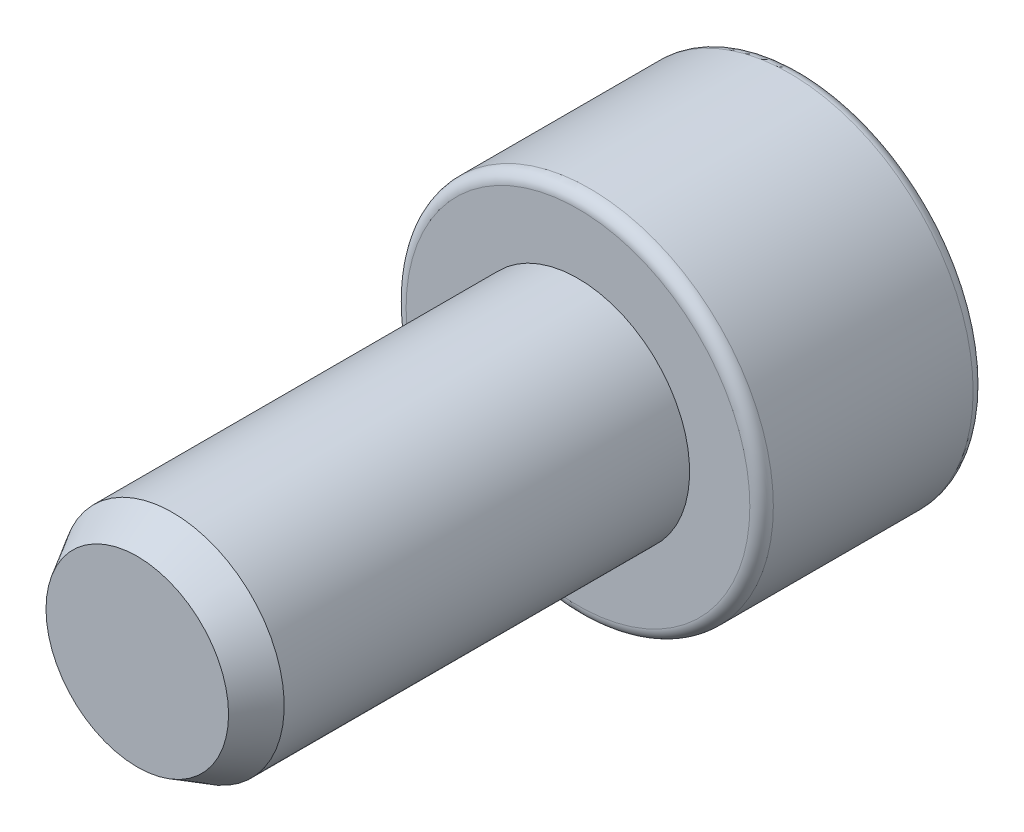
ISO-10303-21;
HEADER;
FILE_DESCRIPTION(('STEP AP214'),'2;1');
FILE_NAME('part.step','',(''),(''),'','','');
FILE_SCHEMA(('AUTOMOTIVE_DESIGN { 1 0 10303 214 1 1 1 1 }'));
ENDSEC;
DATA;
#1=APPLICATION_CONTEXT('core data for automotive mechanical design processes');
#2=APPLICATION_PROTOCOL_DEFINITION('international standard','automotive_design',2000,#1);
#3=PRODUCT_CONTEXT('',#1,'mechanical');
#4=PRODUCT('Part','Part','',(#3));
#5=PRODUCT_RELATED_PRODUCT_CATEGORY('part','',(#4));
#6=PRODUCT_DEFINITION_FORMATION('','',#4);
#7=PRODUCT_DEFINITION_CONTEXT('part definition',#1,'design');
#8=PRODUCT_DEFINITION('design','',#6,#7);
#9=PRODUCT_DEFINITION_SHAPE('','',#8);
#10=(LENGTH_UNIT() NAMED_UNIT(*) SI_UNIT(.MILLI.,.METRE.));
#11=(NAMED_UNIT(*) PLANE_ANGLE_UNIT() SI_UNIT($,.RADIAN.));
#12=(NAMED_UNIT(*) SI_UNIT($,.STERADIAN.) SOLID_ANGLE_UNIT());
#13=UNCERTAINTY_MEASURE_WITH_UNIT(LENGTH_MEASURE(1.E-05),#10,'distance_accuracy_value','');
#14=(GEOMETRIC_REPRESENTATION_CONTEXT(3) GLOBAL_UNCERTAINTY_ASSIGNED_CONTEXT((#13)) GLOBAL_UNIT_ASSIGNED_CONTEXT((#10,
#11,#12)) REPRESENTATION_CONTEXT('',''));
#15=CARTESIAN_POINT('',(0.,0.,0.));
#16=DIRECTION('',(0.,0.,1.));
#17=DIRECTION('',(1.,0.,0.));
#18=AXIS2_PLACEMENT_3D('',#15,#16,#17);
#19=CARTESIAN_POINT('',(3.71474999999991,0.,4.826));
#20=DIRECTION('',(0.,0.,1.));
#21=DIRECTION('',(1.,0.,0.));
#22=AXIS2_PLACEMENT_3D('',#19,#20,#21);
#23=PLANE('',#22);
#24=CARTESIAN_POINT('',(0.,0.,4.826));
#25=DIRECTION('',(0.,0.,1.));
#26=DIRECTION('',(1.,0.,0.));
#27=AXIS2_PLACEMENT_3D('',#24,#25,#26);
#28=CIRCLE('',#27,3.7147499999999);
#29=CARTESIAN_POINT('',(3.71474999999991,0.,4.826));
#30=VERTEX_POINT('',#29);
#31=EDGE_CURVE('E133',#30,#30,#28,.T.);
#32=ORIENTED_EDGE('',*,*,#31,.T.);
#33=EDGE_LOOP('',(#32));
#34=FACE_BOUND('',#33,.T.);
#35=CARTESIAN_POINT('',(0.,0.,4.826));
#36=DIRECTION('',(0.,0.,1.));
#37=DIRECTION('',(1.,0.,0.));
#38=AXIS2_PLACEMENT_3D('',#35,#36,#37);
#39=CIRCLE('',#38,2.413);
#40=CARTESIAN_POINT('',(-2.413,0.,4.826));
#41=VERTEX_POINT('',#40);
#42=EDGE_CURVE('E120',#41,#41,#39,.T.);
#43=ORIENTED_EDGE('',*,*,#42,.F.);
#44=EDGE_LOOP('',(#43));
#45=FACE_BOUND('',#44,.T.);
#46=ADVANCED_FACE('F30',(#34,#45),#23,.T.);
#47=CARTESIAN_POINT('',(0.,0.,0.));
#48=DIRECTION('',(0.,0.,-1.));
#49=DIRECTION('',(-1.,0.,0.));
#50=AXIS2_PLACEMENT_3D('',#47,#48,#49);
#51=PLANE('',#50);
#52=DIRECTION('',(0.866025403784439,0.5,0.));
#53=VECTOR('',#52,1.);
#54=CARTESIAN_POINT('',(-1.984375,1.14567944042317,0.));
#55=LINE('',#54,#53);
#56=CARTESIAN_POINT('',(-1.984375,1.14567944042317,0.));
#57=VERTEX_POINT('',#56);
#58=CARTESIAN_POINT('',(0.,2.29135888084633,0.));
#59=VERTEX_POINT('',#58);
#60=EDGE_CURVE('E45',#57,#59,#55,.T.);
#61=ORIENTED_EDGE('',*,*,#60,.F.);
#62=DIRECTION('',(0.,1.,0.));
#63=VECTOR('',#62,1.);
#64=CARTESIAN_POINT('',(-1.984375,-1.14567944042316,0.));
#65=LINE('',#64,#63);
#66=CARTESIAN_POINT('',(-1.984375,-1.14567944042316,0.));
#67=VERTEX_POINT('',#66);
#68=EDGE_CURVE('E129',#67,#57,#65,.T.);
#69=ORIENTED_EDGE('',*,*,#68,.F.);
#70=DIRECTION('',(-0.866025403784438,0.5,0.));
#71=VECTOR('',#70,1.);
#72=CARTESIAN_POINT('',(0.,-2.29135888084633,0.));
#73=LINE('',#72,#71);
#74=CARTESIAN_POINT('',(0.,-2.29135888084633,0.));
#75=VERTEX_POINT('',#74);
#76=EDGE_CURVE('E127',#75,#67,#73,.T.);
#77=ORIENTED_EDGE('',*,*,#76,.F.);
#78=DIRECTION('',(-0.866025403784438,-0.5,0.));
#79=VECTOR('',#78,1.);
#80=CARTESIAN_POINT('',(1.984375,-1.14567944042316,0.));
#81=LINE('',#80,#79);
#82=CARTESIAN_POINT('',(1.984375,-1.14567944042316,0.));
#83=VERTEX_POINT('',#82);
#84=EDGE_CURVE('E93',#83,#75,#81,.T.);
#85=ORIENTED_EDGE('',*,*,#84,.F.);
#86=DIRECTION('',(0.,-1.,0.));
#87=VECTOR('',#86,1.);
#88=CARTESIAN_POINT('',(1.984375,1.14567944042316,0.));
#89=LINE('',#88,#87);
#90=CARTESIAN_POINT('',(1.984375,1.14567944042316,0.));
#91=VERTEX_POINT('',#90);
#92=EDGE_CURVE('E123',#91,#83,#89,.T.);
#93=ORIENTED_EDGE('',*,*,#92,.F.);
#94=DIRECTION('',(0.866025403784439,-0.5,0.));
#95=VECTOR('',#94,1.);
#96=CARTESIAN_POINT('',(0.,2.29135888084633,0.));
#97=LINE('',#96,#95);
#98=EDGE_CURVE('E119',#59,#91,#97,.T.);
#99=ORIENTED_EDGE('',*,*,#98,.F.);
#100=EDGE_LOOP('',(#61,#69,#77,#85,#93,#99));
#101=FACE_BOUND('',#100,.T.);
#102=CARTESIAN_POINT('',(0.,0.,0.));
#103=DIRECTION('',(0.,0.,1.));
#104=DIRECTION('',(1.,0.,0.));
#105=AXIS2_PLACEMENT_3D('',#102,#103,#104);
#106=CIRCLE('',#105,3.7147499999999);
#107=CARTESIAN_POINT('',(3.71474999999991,0.,0.));
#108=VERTEX_POINT('',#107);
#109=EDGE_CURVE('E147',#108,#108,#106,.T.);
#110=ORIENTED_EDGE('',*,*,#109,.F.);
#111=EDGE_LOOP('',(#110));
#112=FACE_BOUND('',#111,.T.);
#113=ADVANCED_FACE('F163',(#101,#112),#51,.T.);
#114=CARTESIAN_POINT('',(0.,0.,0.254000000000035));
#115=DIRECTION('',(0.,0.,1.));
#116=DIRECTION('',(1.,0.,0.));
#117=AXIS2_PLACEMENT_3D('',#114,#115,#116);
#118=TOROIDAL_SURFACE('',#117,3.7147499999999,0.254000000000001);
#119=ORIENTED_EDGE('',*,*,#109,.T.);
#120=EDGE_LOOP('',(#119));
#121=FACE_BOUND('',#120,.T.);
#122=CARTESIAN_POINT('',(0.,0.,0.254000000000035));
#123=DIRECTION('',(0.,0.,1.));
#124=DIRECTION('',(1.,0.,0.));
#125=AXIS2_PLACEMENT_3D('',#122,#123,#124);
#126=CIRCLE('',#125,3.9687499999999);
#127=CARTESIAN_POINT('',(3.96874999999991,0.,0.254000000000035));
#128=VERTEX_POINT('',#127);
#129=EDGE_CURVE('E144',#128,#128,#126,.T.);
#130=ORIENTED_EDGE('',*,*,#129,.F.);
#131=EDGE_LOOP('',(#130));
#132=FACE_BOUND('',#131,.T.);
#133=ADVANCED_FACE('F169',(#121,#132),#118,.T.);
#134=CARTESIAN_POINT('',(0.,0.,0.));
#135=DIRECTION('',(0.,0.,1.));
#136=DIRECTION('',(1.,0.,0.));
#137=AXIS2_PLACEMENT_3D('',#134,#135,#136);
#138=CYLINDRICAL_SURFACE('',#137,3.9687499999999);
#139=ORIENTED_EDGE('',*,*,#129,.T.);
#140=EDGE_LOOP('',(#139));
#141=FACE_BOUND('',#140,.T.);
#142=CARTESIAN_POINT('',(0.,0.,4.572));
#143=DIRECTION('',(0.,0.,1.));
#144=DIRECTION('',(1.,0.,0.));
#145=AXIS2_PLACEMENT_3D('',#142,#143,#144);
#146=CIRCLE('',#145,3.9687499999999);
#147=CARTESIAN_POINT('',(3.96874999999991,0.,4.572));
#148=VERTEX_POINT('',#147);
#149=EDGE_CURVE('E141',#148,#148,#146,.T.);
#150=ORIENTED_EDGE('',*,*,#149,.F.);
#151=EDGE_LOOP('',(#150));
#152=FACE_BOUND('',#151,.T.);
#153=ADVANCED_FACE('F179',(#141,#152),#138,.T.);
#154=CARTESIAN_POINT('',(0.,0.,4.572));
#155=DIRECTION('',(0.,0.,1.));
#156=DIRECTION('',(1.,0.,0.));
#157=AXIS2_PLACEMENT_3D('',#154,#155,#156);
#158=TOROIDAL_SURFACE('',#157,3.7147499999999,0.254);
#159=ORIENTED_EDGE('',*,*,#149,.T.);
#160=EDGE_LOOP('',(#159));
#161=FACE_BOUND('',#160,.T.);
#162=ORIENTED_EDGE('',*,*,#31,.F.);
#163=EDGE_LOOP('',(#162));
#164=FACE_BOUND('',#163,.T.);
#165=ADVANCED_FACE('F176',(#161,#164),#158,.T.);
#166=CARTESIAN_POINT('',(-1.98437499999998,1.14567944042317,2.54000000000001));
#167=DIRECTION('',(-0.5,0.866025403784439,0.));
#168=DIRECTION('',(-0.866025403784439,-0.5,0.));
#169=AXIS2_PLACEMENT_3D('',#166,#167,#168);
#170=PLANE('',#169);
#171=ORIENTED_EDGE('',*,*,#60,.T.);
#172=DIRECTION('',(0.,0.,-1.));
#173=VECTOR('',#172,1.);
#174=CARTESIAN_POINT('',(0.,2.29135888084633,2.54));
#175=LINE('',#174,#173);
#176=CARTESIAN_POINT('',(0.,2.29135888084633,2.54));
#177=VERTEX_POINT('',#176);
#178=EDGE_CURVE('E75',#177,#59,#175,.T.);
#179=ORIENTED_EDGE('',*,*,#178,.F.);
#180=DIRECTION('',(0.866025403784439,0.5,0.));
#181=VECTOR('',#180,1.);
#182=CARTESIAN_POINT('',(-1.98437499999998,1.14567944042317,2.54000000000001));
#183=LINE('',#182,#181);
#184=CARTESIAN_POINT('',(-1.98437499999998,1.14567944042317,2.54000000000001));
#185=VERTEX_POINT('',#184);
#186=EDGE_CURVE('E131',#185,#177,#183,.T.);
#187=ORIENTED_EDGE('',*,*,#186,.F.);
#188=DIRECTION('',(0.,0.,-1.));
#189=VECTOR('',#188,1.);
#190=CARTESIAN_POINT('',(-1.98437499999998,1.14567944042317,2.54000000000001));
#191=LINE('',#190,#189);
#192=EDGE_CURVE('E53',#185,#57,#191,.T.);
#193=ORIENTED_EDGE('',*,*,#192,.T.);
#194=EDGE_LOOP('',(#171,#179,#187,#193));
#195=FACE_BOUND('',#194,.T.);
#196=ADVANCED_FACE('F174',(#195),#170,.F.);
#197=CARTESIAN_POINT('',(-1.98437499999998,-1.14567944042316,2.54000000000001));
#198=DIRECTION('',(-1.,0.,0.));
#199=DIRECTION('',(0.,0.,1.));
#200=AXIS2_PLACEMENT_3D('',#197,#198,#199);
#201=PLANE('',#200);
#202=ORIENTED_EDGE('',*,*,#68,.T.);
#203=ORIENTED_EDGE('',*,*,#192,.F.);
#204=DIRECTION('',(0.,1.,0.));
#205=VECTOR('',#204,1.);
#206=CARTESIAN_POINT('',(-1.98437499999998,-1.14567944042316,2.54000000000001));
#207=LINE('',#206,#205);
#208=CARTESIAN_POINT('',(-1.98437499999998,-1.14567944042316,2.54000000000001));
#209=VERTEX_POINT('',#208);
#210=EDGE_CURVE('E105',#209,#185,#207,.T.);
#211=ORIENTED_EDGE('',*,*,#210,.F.);
#212=DIRECTION('',(0.,0.,-1.));
#213=VECTOR('',#212,1.);
#214=CARTESIAN_POINT('',(-1.98437499999998,-1.14567944042316,2.54000000000001));
#215=LINE('',#214,#213);
#216=EDGE_CURVE('E97',#209,#67,#215,.T.);
#217=ORIENTED_EDGE('',*,*,#216,.T.);
#218=EDGE_LOOP('',(#202,#203,#211,#217));
#219=FACE_BOUND('',#218,.T.);
#220=ADVANCED_FACE('F212',(#219),#201,.F.);
#221=CARTESIAN_POINT('',(0.,-2.29135888084633,2.54));
#222=DIRECTION('',(-0.5,-0.866025403784438,0.));
#223=DIRECTION('',(0.866025403784438,-0.5,0.));
#224=AXIS2_PLACEMENT_3D('',#221,#222,#223);
#225=PLANE('',#224);
#226=ORIENTED_EDGE('',*,*,#76,.T.);
#227=ORIENTED_EDGE('',*,*,#216,.F.);
#228=DIRECTION('',(-0.866025403784438,0.5,0.));
#229=VECTOR('',#228,1.);
#230=CARTESIAN_POINT('',(0.,-2.29135888084633,2.54));
#231=LINE('',#230,#229);
#232=CARTESIAN_POINT('',(0.,-2.29135888084633,2.54));
#233=VERTEX_POINT('',#232);
#234=EDGE_CURVE('E101',#233,#209,#231,.T.);
#235=ORIENTED_EDGE('',*,*,#234,.F.);
#236=DIRECTION('',(0.,0.,-1.));
#237=VECTOR('',#236,1.);
#238=CARTESIAN_POINT('',(0.,-2.29135888084633,2.54));
#239=LINE('',#238,#237);
#240=EDGE_CURVE('E86',#233,#75,#239,.T.);
#241=ORIENTED_EDGE('',*,*,#240,.T.);
#242=EDGE_LOOP('',(#226,#227,#235,#241));
#243=FACE_BOUND('',#242,.T.);
#244=ADVANCED_FACE('F102',(#243),#225,.F.);
#245=CARTESIAN_POINT('',(1.98437500000002,-1.14567944042316,2.53999999999999));
#246=DIRECTION('',(0.5,-0.866025403784438,0.));
#247=DIRECTION('',(0.866025403784439,0.5,0.));
#248=AXIS2_PLACEMENT_3D('',#245,#246,#247);
#249=PLANE('',#248);
#250=ORIENTED_EDGE('',*,*,#84,.T.);
#251=ORIENTED_EDGE('',*,*,#240,.F.);
#252=DIRECTION('',(-0.866025403784438,-0.5,0.));
#253=VECTOR('',#252,1.);
#254=CARTESIAN_POINT('',(1.98437500000002,-1.14567944042316,2.53999999999999));
#255=LINE('',#254,#253);
#256=CARTESIAN_POINT('',(1.98437500000002,-1.14567944042316,2.53999999999999));
#257=VERTEX_POINT('',#256);
#258=EDGE_CURVE('E90',#257,#233,#255,.T.);
#259=ORIENTED_EDGE('',*,*,#258,.F.);
#260=DIRECTION('',(0.,0.,-1.));
#261=VECTOR('',#260,1.);
#262=CARTESIAN_POINT('',(1.98437500000002,-1.14567944042316,2.53999999999999));
#263=LINE('',#262,#261);
#264=EDGE_CURVE('E98',#257,#83,#263,.T.);
#265=ORIENTED_EDGE('',*,*,#264,.T.);
#266=EDGE_LOOP('',(#250,#251,#259,#265));
#267=FACE_BOUND('',#266,.T.);
#268=ADVANCED_FACE('F88',(#267),#249,.F.);
#269=CARTESIAN_POINT('',(1.98437500000002,1.14567944042316,2.53999999999999));
#270=DIRECTION('',(1.,0.,0.));
#271=DIRECTION('',(0.,0.,-1.));
#272=AXIS2_PLACEMENT_3D('',#269,#270,#271);
#273=PLANE('',#272);
#274=ORIENTED_EDGE('',*,*,#92,.T.);
#275=ORIENTED_EDGE('',*,*,#264,.F.);
#276=DIRECTION('',(0.,-1.,0.));
#277=VECTOR('',#276,1.);
#278=CARTESIAN_POINT('',(1.98437500000002,1.14567944042316,2.53999999999999));
#279=LINE('',#278,#277);
#280=CARTESIAN_POINT('',(1.98437500000002,1.14567944042316,2.53999999999999));
#281=VERTEX_POINT('',#280);
#282=EDGE_CURVE('E111',#281,#257,#279,.T.);
#283=ORIENTED_EDGE('',*,*,#282,.F.);
#284=DIRECTION('',(0.,0.,-1.));
#285=VECTOR('',#284,1.);
#286=CARTESIAN_POINT('',(1.98437500000002,1.14567944042316,2.53999999999999));
#287=LINE('',#286,#285);
#288=EDGE_CURVE('E136',#281,#91,#287,.T.);
#289=ORIENTED_EDGE('',*,*,#288,.T.);
#290=EDGE_LOOP('',(#274,#275,#283,#289));
#291=FACE_BOUND('',#290,.T.);
#292=ADVANCED_FACE('F230',(#291),#273,.F.);
#293=CARTESIAN_POINT('',(0.,2.29135888084633,2.54));
#294=DIRECTION('',(0.5,0.866025403784439,0.));
#295=DIRECTION('',(-0.866025403784439,0.5,0.));
#296=AXIS2_PLACEMENT_3D('',#293,#294,#295);
#297=PLANE('',#296);
#298=ORIENTED_EDGE('',*,*,#98,.T.);
#299=ORIENTED_EDGE('',*,*,#288,.F.);
#300=DIRECTION('',(0.866025403784439,-0.5,0.));
#301=VECTOR('',#300,1.);
#302=CARTESIAN_POINT('',(0.,2.29135888084633,2.54));
#303=LINE('',#302,#301);
#304=EDGE_CURVE('E113',#177,#281,#303,.T.);
#305=ORIENTED_EDGE('',*,*,#304,.F.);
#306=ORIENTED_EDGE('',*,*,#178,.T.);
#307=EDGE_LOOP('',(#298,#299,#305,#306));
#308=FACE_BOUND('',#307,.T.);
#309=ADVANCED_FACE('F237',(#308),#297,.F.);
#310=CARTESIAN_POINT('',(0.,2.29135888084633,2.54));
#311=DIRECTION('',(0.,0.,-1.));
#312=DIRECTION('',(-1.,0.,0.));
#313=AXIS2_PLACEMENT_3D('',#310,#311,#312);
#314=PLANE('',#313);
#315=ORIENTED_EDGE('',*,*,#186,.T.);
#316=ORIENTED_EDGE('',*,*,#304,.T.);
#317=ORIENTED_EDGE('',*,*,#282,.T.);
#318=ORIENTED_EDGE('',*,*,#258,.T.);
#319=ORIENTED_EDGE('',*,*,#234,.T.);
#320=ORIENTED_EDGE('',*,*,#210,.T.);
#321=EDGE_LOOP('',(#315,#316,#317,#318,#319,#320));
#322=FACE_BOUND('',#321,.T.);
#323=ADVANCED_FACE('F108',(#322),#314,.T.);
#324=CARTESIAN_POINT('',(0.,0.,14.351));
#325=DIRECTION('',(0.,0.,-1.));
#326=DIRECTION('',(-1.,0.,0.));
#327=AXIS2_PLACEMENT_3D('',#324,#325,#326);
#328=CYLINDRICAL_SURFACE('',#327,2.413);
#329=CARTESIAN_POINT('',(0.,0.,13.589));
#330=DIRECTION('',(0.,0.,1.));
#331=DIRECTION('',(1.,0.,0.));
#332=AXIS2_PLACEMENT_3D('',#329,#330,#331);
#333=CIRCLE('',#332,2.413);
#334=CARTESIAN_POINT('',(-2.413,0.,13.589));
#335=VERTEX_POINT('',#334);
#336=EDGE_CURVE('E11',#335,#335,#333,.F.);
#337=CARTESIAN_POINT('',(-2.413,0.,13.589));
#338=CARTESIAN_POINT('',(-2.413,0.,13.49771875));
#339=CARTESIAN_POINT('',(-2.413,0.,13.4064375));
#340=CARTESIAN_POINT('',(-2.413,0.,13.223875));
#341=CARTESIAN_POINT('',(-2.413,0.,13.13259375));
#342=CARTESIAN_POINT('',(-2.413,0.,12.95003125));
#343=CARTESIAN_POINT('',(-2.413,0.,12.85875));
#344=CARTESIAN_POINT('',(-2.413,0.,12.6761875));
#345=CARTESIAN_POINT('',(-2.413,0.,12.58490625));
#346=CARTESIAN_POINT('',(-2.413,0.,12.40234375));
#347=CARTESIAN_POINT('',(-2.413,0.,12.3110625));
#348=CARTESIAN_POINT('',(-2.413,0.,12.1285));
#349=CARTESIAN_POINT('',(-2.413,0.,12.03721875));
#350=CARTESIAN_POINT('',(-2.413,0.,11.85465625));
#351=CARTESIAN_POINT('',(-2.413,0.,11.763375));
#352=CARTESIAN_POINT('',(-2.413,0.,11.5808125));
#353=CARTESIAN_POINT('',(-2.413,0.,11.48953125));
#354=CARTESIAN_POINT('',(-2.413,0.,11.30696875));
#355=CARTESIAN_POINT('',(-2.413,0.,11.2156875));
#356=CARTESIAN_POINT('',(-2.413,0.,11.033125));
#357=CARTESIAN_POINT('',(-2.413,0.,10.94184375));
#358=CARTESIAN_POINT('',(-2.413,0.,10.75928125));
#359=CARTESIAN_POINT('',(-2.413,0.,10.668));
#360=CARTESIAN_POINT('',(-2.413,0.,10.4854375));
#361=CARTESIAN_POINT('',(-2.413,0.,10.39415625));
#362=CARTESIAN_POINT('',(-2.413,0.,10.21159375));
#363=CARTESIAN_POINT('',(-2.413,0.,10.1203125));
#364=CARTESIAN_POINT('',(-2.413,0.,9.93775000000001));
#365=CARTESIAN_POINT('',(-2.413,0.,9.84646875000001));
#366=CARTESIAN_POINT('',(-2.413,0.,9.66390625000001));
#367=CARTESIAN_POINT('',(-2.413,0.,9.57262500000001));
#368=CARTESIAN_POINT('',(-2.413,0.,9.39006250000001));
#369=CARTESIAN_POINT('',(-2.413,0.,9.29878125000001));
#370=CARTESIAN_POINT('',(-2.413,0.,9.11621875000001));
#371=CARTESIAN_POINT('',(-2.413,0.,9.02493750000001));
#372=CARTESIAN_POINT('',(-2.413,0.,8.842375));
#373=CARTESIAN_POINT('',(-2.413,0.,8.75109375000001));
#374=CARTESIAN_POINT('',(-2.413,0.,8.56853125000001));
#375=CARTESIAN_POINT('',(-2.413,0.,8.47725000000001));
#376=CARTESIAN_POINT('',(-2.413,0.,8.29468750000001));
#377=CARTESIAN_POINT('',(-2.413,0.,8.20340625000001));
#378=CARTESIAN_POINT('',(-2.413,0.,8.02084375));
#379=CARTESIAN_POINT('',(-2.413,0.,7.9295625));
#380=CARTESIAN_POINT('',(-2.413,0.,7.747));
#381=CARTESIAN_POINT('',(-2.413,0.,7.65571875));
#382=CARTESIAN_POINT('',(-2.413,0.,7.47315625));
#383=CARTESIAN_POINT('',(-2.413,0.,7.381875));
#384=CARTESIAN_POINT('',(-2.413,0.,7.1993125));
#385=CARTESIAN_POINT('',(-2.413,0.,7.10803125));
#386=CARTESIAN_POINT('',(-2.413,0.,6.92546875));
#387=CARTESIAN_POINT('',(-2.413,0.,6.8341875));
#388=CARTESIAN_POINT('',(-2.413,0.,6.651625));
#389=CARTESIAN_POINT('',(-2.413,0.,6.56034375));
#390=CARTESIAN_POINT('',(-2.413,0.,6.37778125));
#391=CARTESIAN_POINT('',(-2.413,0.,6.2865));
#392=CARTESIAN_POINT('',(-2.413,0.,6.1039375));
#393=CARTESIAN_POINT('',(-2.413,0.,6.01265625));
#394=CARTESIAN_POINT('',(-2.413,0.,5.83009375));
#395=CARTESIAN_POINT('',(-2.413,0.,5.7388125));
#396=CARTESIAN_POINT('',(-2.413,0.,5.55625));
#397=CARTESIAN_POINT('',(-2.413,0.,5.46496875));
#398=CARTESIAN_POINT('',(-2.413,0.,5.28240625));
#399=CARTESIAN_POINT('',(-2.413,0.,5.191125));
#400=CARTESIAN_POINT('',(-2.413,0.,5.0085625));
#401=CARTESIAN_POINT('',(-2.413,0.,4.91728125));
#402=CARTESIAN_POINT('',(-2.413,0.,4.826));
#403=B_SPLINE_CURVE_WITH_KNOTS('',3,(#337,#338,#339,#340,#341,#342,#343,#344,#345,#346,#347,
#348,#349,#350,#351,#352,#353,#354,#355,#356,#357,#358,#359,#360,#361,#362,#363,#364,#365,#366,
#367,#368,#369,#370,#371,#372,#373,#374,#375,#376,#377,#378,#379,#380,#381,#382,#383,#384,#385,
#386,#387,#388,#389,#390,#391,#392,#393,#394,#395,#396,#397,#398,#399,#400,#401,#402),
.UNSPECIFIED.,.F.,.F.,(4,2,2,2,2,2,2,2,2,2,2,2,2,2,2,2,2,2,2,2,2,2,2,2,2,2,2,2,2,2,2,2,4),(0.,
0.273843749999999,0.5476875,0.82153125,1.095375,1.36921875,1.6430625,1.91690625,2.19075,
2.46459375,2.7384375,3.01228125,3.286125,3.55996875,3.83381250000001,4.10765625000001,
4.38150000000001,4.65534375000001,4.92918750000001,5.20303125000001,5.47687500000001,
5.75071875000001,6.02456250000001,6.29840625000001,6.57225000000001,6.84609375000001,
7.11993750000001,7.39378125000001,7.66762500000001,7.94146875000001,8.21531250000001,
8.48915625000001,8.76300000000001),.UNSPECIFIED.);
#404=EDGE_CURVE('BSEAM159',#335,#41,#403,.T.);
#405=ORIENTED_EDGE('',*,*,#336,.T.);
#406=ORIENTED_EDGE('',*,*,#42,.T.);
#407=ORIENTED_EDGE('',*,*,#404,.T.);
#408=ORIENTED_EDGE('',*,*,#404,.F.);
#409=EDGE_LOOP('',(#405,#407,#406,#408));
#410=FACE_BOUND('',#409,.T.);
#411=ADVANCED_FACE('F159',(#410),#328,.T.);
#412=CARTESIAN_POINT('',(0.,0.,14.351));
#413=DIRECTION('',(0.,0.,1.));
#414=DIRECTION('',(1.,0.,0.));
#415=AXIS2_PLACEMENT_3D('',#412,#413,#414);
#416=PLANE('',#415);
#417=CARTESIAN_POINT('',(0.,0.,14.351));
#418=DIRECTION('',(0.,0.,1.));
#419=DIRECTION('',(1.,0.,0.));
#420=AXIS2_PLACEMENT_3D('',#417,#418,#419);
#421=CIRCLE('',#420,1.97305909487752);
#422=CARTESIAN_POINT('',(1.97305909487752,0.,14.351));
#423=VERTEX_POINT('',#422);
#424=EDGE_CURVE('E38',#423,#423,#421,.T.);
#425=ORIENTED_EDGE('',*,*,#424,.T.);
#426=EDGE_LOOP('',(#425));
#427=FACE_BOUND('',#426,.T.);
#428=ADVANCED_FACE('F152',(#427),#416,.T.);
#429=CARTESIAN_POINT('',(0.,0.,14.351));
#430=DIRECTION('',(0.,0.,-1.));
#431=DIRECTION('',(-1.,0.,0.));
#432=AXIS2_PLACEMENT_3D('',#429,#430,#431);
#433=CONICAL_SURFACE('',#432,1.97305909487752,0.523598775598296);
#434=ORIENTED_EDGE('',*,*,#336,.F.);
#435=EDGE_LOOP('',(#434));
#436=FACE_BOUND('',#435,.T.);
#437=ORIENTED_EDGE('',*,*,#424,.F.);
#438=EDGE_LOOP('',(#437));
#439=FACE_BOUND('',#438,.T.);
#440=ADVANCED_FACE('F32',(#436,#439),#433,.T.);
#441=CLOSED_SHELL('',(#46,#113,#133,#153,#165,#196,#220,#244,#268,#292,#309,#323,#411,#428,#440));
#442=MANIFOLD_SOLID_BREP('B2',#441);
#443=ADVANCED_BREP_SHAPE_REPRESENTATION('',(#18,#442),#14);
#444=SHAPE_DEFINITION_REPRESENTATION(#9,#443);
ENDSEC;
END-ISO-10303-21;
